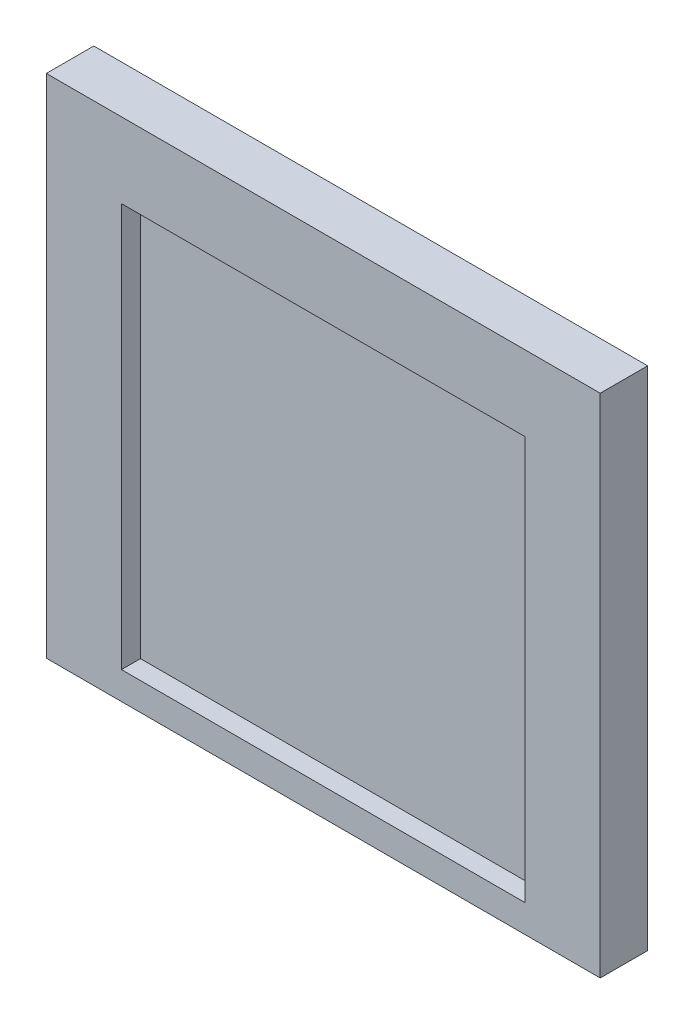
ISO-10303-21;
HEADER;
FILE_DESCRIPTION(('STEP AP214'),'2;1');
FILE_NAME('part.step','',(''),(''),'','','');
FILE_SCHEMA(('AUTOMOTIVE_DESIGN { 1 0 10303 214 1 1 1 1 }'));
ENDSEC;
DATA;
#1=APPLICATION_CONTEXT('core data for automotive mechanical design processes');
#2=APPLICATION_PROTOCOL_DEFINITION('international standard','automotive_design',2000,#1);
#3=PRODUCT_CONTEXT('',#1,'mechanical');
#4=PRODUCT('Part','Part','',(#3));
#5=PRODUCT_RELATED_PRODUCT_CATEGORY('part','',(#4));
#6=PRODUCT_DEFINITION_FORMATION('','',#4);
#7=PRODUCT_DEFINITION_CONTEXT('part definition',#1,'design');
#8=PRODUCT_DEFINITION('design','',#6,#7);
#9=PRODUCT_DEFINITION_SHAPE('','',#8);
#10=(LENGTH_UNIT() NAMED_UNIT(*) SI_UNIT(.MILLI.,.METRE.));
#11=(NAMED_UNIT(*) PLANE_ANGLE_UNIT() SI_UNIT($,.RADIAN.));
#12=(NAMED_UNIT(*) SI_UNIT($,.STERADIAN.) SOLID_ANGLE_UNIT());
#13=UNCERTAINTY_MEASURE_WITH_UNIT(LENGTH_MEASURE(1.E-05),#10,'distance_accuracy_value','');
#14=(GEOMETRIC_REPRESENTATION_CONTEXT(3) GLOBAL_UNCERTAINTY_ASSIGNED_CONTEXT((#13)) GLOBAL_UNIT_ASSIGNED_CONTEXT((#10,
#11,#12)) REPRESENTATION_CONTEXT('',''));
#15=CARTESIAN_POINT('',(0.,0.,0.));
#16=DIRECTION('',(0.,0.,1.));
#17=DIRECTION('',(1.,0.,0.));
#18=AXIS2_PLACEMENT_3D('',#15,#16,#17);
#19=CARTESIAN_POINT('',(0.,0.,3.));
#20=DIRECTION('',(1.,0.,0.));
#21=DIRECTION('',(0.,1.,0.));
#22=AXIS2_PLACEMENT_3D('',#19,#20,#21);
#23=PLANE('',#22);
#24=DIRECTION('',(0.,0.,-1.));
#25=VECTOR('',#24,1.);
#26=CARTESIAN_POINT('',(0.,3.,3.));
#27=LINE('',#26,#25);
#28=CARTESIAN_POINT('',(0.,3.,3.));
#29=VERTEX_POINT('',#28);
#30=CARTESIAN_POINT('',(0.,3.,0.));
#31=VERTEX_POINT('',#30);
#32=EDGE_CURVE('E47',#29,#31,#27,.T.);
#33=ORIENTED_EDGE('',*,*,#32,.F.);
#34=DIRECTION('',(0.,-1.,0.));
#35=VECTOR('',#34,1.);
#36=CARTESIAN_POINT('',(0.,0.,3.));
#37=LINE('',#36,#35);
#38=CARTESIAN_POINT('',(0.,35.,3.));
#39=VERTEX_POINT('',#38);
#40=EDGE_CURVE('E117',#39,#29,#37,.T.);
#41=ORIENTED_EDGE('',*,*,#40,.F.);
#42=DIRECTION('',(0.,0.,-1.));
#43=VECTOR('',#42,1.);
#44=CARTESIAN_POINT('',(0.,35.,3.));
#45=LINE('',#44,#43);
#46=CARTESIAN_POINT('',(0.,35.,0.));
#47=VERTEX_POINT('',#46);
#48=EDGE_CURVE('E40',#39,#47,#45,.T.);
#49=ORIENTED_EDGE('',*,*,#48,.T.);
#50=DIRECTION('',(0.,-1.,0.));
#51=VECTOR('',#50,1.);
#52=CARTESIAN_POINT('',(0.,0.,0.));
#53=LINE('',#52,#51);
#54=EDGE_CURVE('E115',#47,#31,#53,.T.);
#55=ORIENTED_EDGE('',*,*,#54,.T.);
#56=EDGE_LOOP('',(#33,#41,#49,#55));
#57=FACE_BOUND('',#56,.T.);
#58=ADVANCED_FACE('F33',(#57),#23,.F.);
#59=CARTESIAN_POINT('',(35.,0.,3.));
#60=DIRECTION('',(-1.,0.,0.));
#61=DIRECTION('',(0.,-1.,0.));
#62=AXIS2_PLACEMENT_3D('',#59,#60,#61);
#63=PLANE('',#62);
#64=DIRECTION('',(0.,0.,1.));
#65=VECTOR('',#64,1.);
#66=CARTESIAN_POINT('',(35.,3.,0.));
#67=LINE('',#66,#65);
#68=CARTESIAN_POINT('',(35.,3.,0.));
#69=VERTEX_POINT('',#68);
#70=CARTESIAN_POINT('',(35.,3.,3.));
#71=VERTEX_POINT('',#70);
#72=EDGE_CURVE('E97',#69,#71,#67,.T.);
#73=ORIENTED_EDGE('',*,*,#72,.F.);
#74=DIRECTION('',(0.,1.,0.));
#75=VECTOR('',#74,1.);
#76=CARTESIAN_POINT('',(35.,0.,0.));
#77=LINE('',#76,#75);
#78=CARTESIAN_POINT('',(35.,35.,0.));
#79=VERTEX_POINT('',#78);
#80=EDGE_CURVE('E108',#69,#79,#77,.T.);
#81=ORIENTED_EDGE('',*,*,#80,.T.);
#82=DIRECTION('',(0.,0.,-1.));
#83=VECTOR('',#82,1.);
#84=CARTESIAN_POINT('',(35.,35.,3.));
#85=LINE('',#84,#83);
#86=CARTESIAN_POINT('',(35.,35.,3.));
#87=VERTEX_POINT('',#86);
#88=EDGE_CURVE('E11',#87,#79,#85,.T.);
#89=ORIENTED_EDGE('',*,*,#88,.F.);
#90=DIRECTION('',(0.,1.,0.));
#91=VECTOR('',#90,1.);
#92=CARTESIAN_POINT('',(35.,0.,3.));
#93=LINE('',#92,#91);
#94=EDGE_CURVE('E109',#71,#87,#93,.T.);
#95=ORIENTED_EDGE('',*,*,#94,.F.);
#96=EDGE_LOOP('',(#73,#81,#89,#95));
#97=FACE_BOUND('',#96,.T.);
#98=ADVANCED_FACE('F106',(#97),#63,.F.);
#99=CARTESIAN_POINT('',(0.,0.,3.));
#100=DIRECTION('',(0.,0.,-1.));
#101=DIRECTION('',(-1.,0.,0.));
#102=AXIS2_PLACEMENT_3D('',#99,#100,#101);
#103=PLANE('',#102);
#104=DIRECTION('',(1.,0.,0.));
#105=VECTOR('',#104,1.);
#106=CARTESIAN_POINT('',(4.74999999999999,4.75,3.));
#107=LINE('',#106,#105);
#108=CARTESIAN_POINT('',(4.74999999999999,4.75,3.));
#109=VERTEX_POINT('',#108);
#110=CARTESIAN_POINT('',(30.25,4.75,3.));
#111=VERTEX_POINT('',#110);
#112=EDGE_CURVE('E148',#109,#111,#107,.T.);
#113=ORIENTED_EDGE('',*,*,#112,.F.);
#114=DIRECTION('',(0.,-1.,0.));
#115=VECTOR('',#114,1.);
#116=CARTESIAN_POINT('',(4.74999999999999,30.25,3.));
#117=LINE('',#116,#115);
#118=CARTESIAN_POINT('',(4.74999999999999,30.25,3.));
#119=VERTEX_POINT('',#118);
#120=EDGE_CURVE('E55',#119,#109,#117,.T.);
#121=ORIENTED_EDGE('',*,*,#120,.F.);
#122=DIRECTION('',(-1.,0.,0.));
#123=VECTOR('',#122,1.);
#124=CARTESIAN_POINT('',(4.74999999999999,30.25,3.));
#125=LINE('',#124,#123);
#126=CARTESIAN_POINT('',(30.25,30.25,3.));
#127=VERTEX_POINT('',#126);
#128=EDGE_CURVE('E141',#127,#119,#125,.T.);
#129=ORIENTED_EDGE('',*,*,#128,.F.);
#130=DIRECTION('',(0.,1.,0.));
#131=VECTOR('',#130,1.);
#132=CARTESIAN_POINT('',(30.25,30.25,3.));
#133=LINE('',#132,#131);
#134=EDGE_CURVE('E145',#111,#127,#133,.T.);
#135=ORIENTED_EDGE('',*,*,#134,.F.);
#136=EDGE_LOOP('',(#113,#121,#129,#135));
#137=FACE_BOUND('',#136,.T.);
#138=DIRECTION('',(-1.,0.,0.));
#139=VECTOR('',#138,1.);
#140=CARTESIAN_POINT('',(35.,3.,3.));
#141=LINE('',#140,#139);
#142=EDGE_CURVE('E110',#71,#29,#141,.T.);
#143=ORIENTED_EDGE('',*,*,#142,.F.);
#144=ORIENTED_EDGE('',*,*,#94,.T.);
#145=DIRECTION('',(-1.,0.,0.));
#146=VECTOR('',#145,1.);
#147=CARTESIAN_POINT('',(0.,35.,3.));
#148=LINE('',#147,#146);
#149=EDGE_CURVE('E123',#87,#39,#148,.T.);
#150=ORIENTED_EDGE('',*,*,#149,.T.);
#151=ORIENTED_EDGE('',*,*,#40,.T.);
#152=EDGE_LOOP('',(#143,#144,#150,#151));
#153=FACE_BOUND('',#152,.T.);
#154=ADVANCED_FACE('F163',(#137,#153),#103,.F.);
#155=CARTESIAN_POINT('',(0.,0.,0.));
#156=DIRECTION('',(0.,0.,-1.));
#157=DIRECTION('',(-1.,0.,0.));
#158=AXIS2_PLACEMENT_3D('',#155,#156,#157);
#159=PLANE('',#158);
#160=ORIENTED_EDGE('',*,*,#80,.F.);
#161=DIRECTION('',(1.,0.,0.));
#162=VECTOR('',#161,1.);
#163=CARTESIAN_POINT('',(0.,3.,0.));
#164=LINE('',#163,#162);
#165=EDGE_CURVE('E94',#31,#69,#164,.T.);
#166=ORIENTED_EDGE('',*,*,#165,.F.);
#167=ORIENTED_EDGE('',*,*,#54,.F.);
#168=DIRECTION('',(-1.,0.,0.));
#169=VECTOR('',#168,1.);
#170=CARTESIAN_POINT('',(0.,35.,0.));
#171=LINE('',#170,#169);
#172=EDGE_CURVE('E114',#79,#47,#171,.T.);
#173=ORIENTED_EDGE('',*,*,#172,.F.);
#174=EDGE_LOOP('',(#160,#166,#167,#173));
#175=FACE_BOUND('',#174,.T.);
#176=ADVANCED_FACE('F113',(#175),#159,.T.);
#177=CARTESIAN_POINT('',(0.,35.,3.));
#178=DIRECTION('',(0.,-1.,0.));
#179=DIRECTION('',(0.,0.,-1.));
#180=AXIS2_PLACEMENT_3D('',#177,#178,#179);
#181=PLANE('',#180);
#182=ORIENTED_EDGE('',*,*,#172,.T.);
#183=ORIENTED_EDGE('',*,*,#48,.F.);
#184=ORIENTED_EDGE('',*,*,#149,.F.);
#185=ORIENTED_EDGE('',*,*,#88,.T.);
#186=EDGE_LOOP('',(#182,#183,#184,#185));
#187=FACE_BOUND('',#186,.T.);
#188=ADVANCED_FACE('F171',(#187),#181,.F.);
#189=CARTESIAN_POINT('',(4.74999999999999,30.25,1.8));
#190=DIRECTION('',(-1.,0.,0.));
#191=DIRECTION('',(0.,0.,1.));
#192=AXIS2_PLACEMENT_3D('',#189,#190,#191);
#193=PLANE('',#192);
#194=ORIENTED_EDGE('',*,*,#120,.T.);
#195=DIRECTION('',(0.,0.,1.));
#196=VECTOR('',#195,1.);
#197=CARTESIAN_POINT('',(4.74999999999999,4.75,1.8));
#198=LINE('',#197,#196);
#199=CARTESIAN_POINT('',(4.74999999999999,4.75,1.8));
#200=VERTEX_POINT('',#199);
#201=EDGE_CURVE('E133',#200,#109,#198,.T.);
#202=ORIENTED_EDGE('',*,*,#201,.F.);
#203=DIRECTION('',(0.,-1.,0.));
#204=VECTOR('',#203,1.);
#205=CARTESIAN_POINT('',(4.74999999999999,30.25,1.8));
#206=LINE('',#205,#204);
#207=CARTESIAN_POINT('',(4.74999999999999,30.25,1.8));
#208=VERTEX_POINT('',#207);
#209=EDGE_CURVE('E144',#208,#200,#206,.T.);
#210=ORIENTED_EDGE('',*,*,#209,.F.);
#211=DIRECTION('',(0.,0.,1.));
#212=VECTOR('',#211,1.);
#213=CARTESIAN_POINT('',(4.74999999999999,30.25,1.8));
#214=LINE('',#213,#212);
#215=EDGE_CURVE('E119',#208,#119,#214,.T.);
#216=ORIENTED_EDGE('',*,*,#215,.T.);
#217=EDGE_LOOP('',(#194,#202,#210,#216));
#218=FACE_BOUND('',#217,.T.);
#219=ADVANCED_FACE('F233',(#218),#193,.F.);
#220=CARTESIAN_POINT('',(4.74999999999999,30.25,1.8));
#221=DIRECTION('',(0.,1.,0.));
#222=DIRECTION('',(0.,0.,1.));
#223=AXIS2_PLACEMENT_3D('',#220,#221,#222);
#224=PLANE('',#223);
#225=ORIENTED_EDGE('',*,*,#128,.T.);
#226=ORIENTED_EDGE('',*,*,#215,.F.);
#227=DIRECTION('',(-1.,0.,0.));
#228=VECTOR('',#227,1.);
#229=CARTESIAN_POINT('',(4.74999999999999,30.25,1.8));
#230=LINE('',#229,#228);
#231=CARTESIAN_POINT('',(30.25,30.25,1.8));
#232=VERTEX_POINT('',#231);
#233=EDGE_CURVE('E136',#232,#208,#230,.T.);
#234=ORIENTED_EDGE('',*,*,#233,.F.);
#235=DIRECTION('',(0.,0.,1.));
#236=VECTOR('',#235,1.);
#237=CARTESIAN_POINT('',(30.25,30.25,1.8));
#238=LINE('',#237,#236);
#239=EDGE_CURVE('E138',#232,#127,#238,.T.);
#240=ORIENTED_EDGE('',*,*,#239,.T.);
#241=EDGE_LOOP('',(#225,#226,#234,#240));
#242=FACE_BOUND('',#241,.T.);
#243=ADVANCED_FACE('F224',(#242),#224,.F.);
#244=CARTESIAN_POINT('',(30.25,30.25,1.8));
#245=DIRECTION('',(1.,0.,0.));
#246=DIRECTION('',(0.,0.,-1.));
#247=AXIS2_PLACEMENT_3D('',#244,#245,#246);
#248=PLANE('',#247);
#249=ORIENTED_EDGE('',*,*,#134,.T.);
#250=ORIENTED_EDGE('',*,*,#239,.F.);
#251=DIRECTION('',(0.,1.,0.));
#252=VECTOR('',#251,1.);
#253=CARTESIAN_POINT('',(30.25,30.25,1.8));
#254=LINE('',#253,#252);
#255=CARTESIAN_POINT('',(30.25,4.75,1.8));
#256=VERTEX_POINT('',#255);
#257=EDGE_CURVE('E154',#256,#232,#254,.T.);
#258=ORIENTED_EDGE('',*,*,#257,.F.);
#259=DIRECTION('',(0.,0.,1.));
#260=VECTOR('',#259,1.);
#261=CARTESIAN_POINT('',(30.25,4.75,1.8));
#262=LINE('',#261,#260);
#263=EDGE_CURVE('E135',#256,#111,#262,.T.);
#264=ORIENTED_EDGE('',*,*,#263,.T.);
#265=EDGE_LOOP('',(#249,#250,#258,#264));
#266=FACE_BOUND('',#265,.T.);
#267=ADVANCED_FACE('F215',(#266),#248,.F.);
#268=CARTESIAN_POINT('',(4.74999999999999,4.75,1.8));
#269=DIRECTION('',(0.,-1.,0.));
#270=DIRECTION('',(0.,0.,-1.));
#271=AXIS2_PLACEMENT_3D('',#268,#269,#270);
#272=PLANE('',#271);
#273=ORIENTED_EDGE('',*,*,#112,.T.);
#274=ORIENTED_EDGE('',*,*,#263,.F.);
#275=DIRECTION('',(1.,0.,0.));
#276=VECTOR('',#275,1.);
#277=CARTESIAN_POINT('',(4.74999999999999,4.75,1.8));
#278=LINE('',#277,#276);
#279=EDGE_CURVE('E157',#200,#256,#278,.T.);
#280=ORIENTED_EDGE('',*,*,#279,.F.);
#281=ORIENTED_EDGE('',*,*,#201,.T.);
#282=EDGE_LOOP('',(#273,#274,#280,#281));
#283=FACE_BOUND('',#282,.T.);
#284=ADVANCED_FACE('F208',(#283),#272,.F.);
#285=CARTESIAN_POINT('',(0.,0.,1.8));
#286=DIRECTION('',(0.,0.,1.));
#287=DIRECTION('',(1.,0.,0.));
#288=AXIS2_PLACEMENT_3D('',#285,#286,#287);
#289=PLANE('',#288);
#290=ORIENTED_EDGE('',*,*,#209,.T.);
#291=ORIENTED_EDGE('',*,*,#279,.T.);
#292=ORIENTED_EDGE('',*,*,#257,.T.);
#293=ORIENTED_EDGE('',*,*,#233,.T.);
#294=EDGE_LOOP('',(#290,#291,#292,#293));
#295=FACE_BOUND('',#294,.T.);
#296=ADVANCED_FACE('F184',(#295),#289,.T.);
#297=CARTESIAN_POINT('',(0.,3.,0.));
#298=DIRECTION('',(0.,-1.,0.));
#299=DIRECTION('',(0.,0.,-1.));
#300=AXIS2_PLACEMENT_3D('',#297,#298,#299);
#301=PLANE('',#300);
#302=ORIENTED_EDGE('',*,*,#32,.T.);
#303=ORIENTED_EDGE('',*,*,#165,.T.);
#304=ORIENTED_EDGE('',*,*,#72,.T.);
#305=ORIENTED_EDGE('',*,*,#142,.T.);
#306=EDGE_LOOP('',(#302,#303,#304,#305));
#307=FACE_BOUND('',#306,.T.);
#308=ADVANCED_FACE('F96',(#307),#301,.T.);
#309=CLOSED_SHELL('',(#58,#98,#154,#176,#188,#219,#243,#267,#284,#296,#308));
#310=MANIFOLD_SOLID_BREP('B2',#309);
#311=ADVANCED_BREP_SHAPE_REPRESENTATION('',(#18,#310),#14);
#312=SHAPE_DEFINITION_REPRESENTATION(#9,#311);
ENDSEC;
END-ISO-10303-21;
